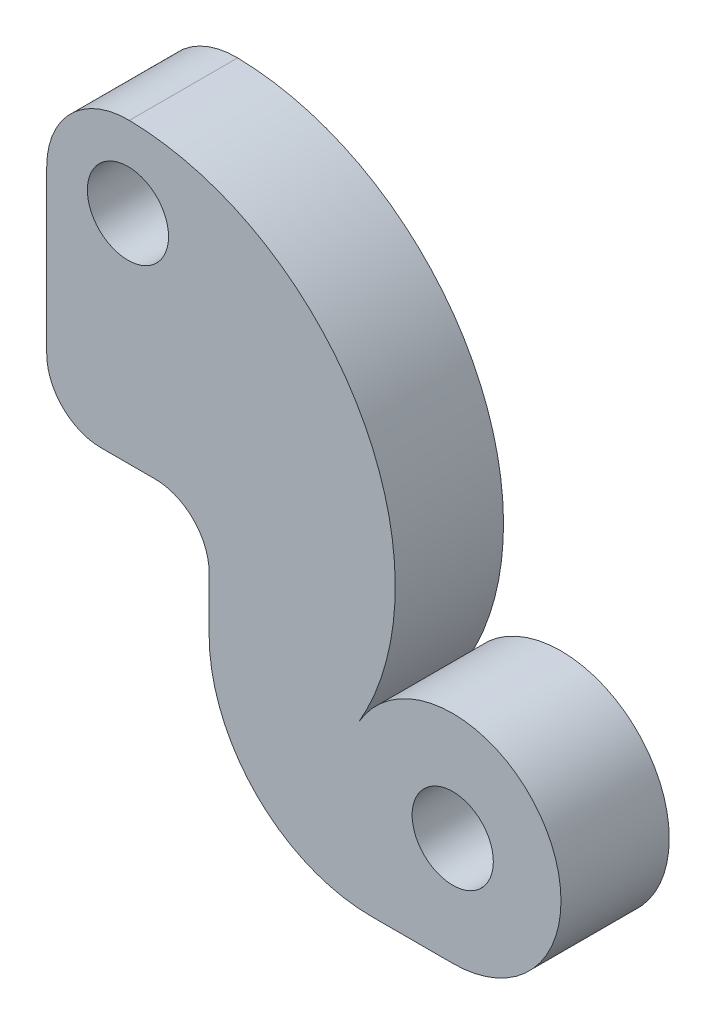
ISO-10303-21;
HEADER;
FILE_DESCRIPTION(('STEP AP214'),'2;1');
FILE_NAME('part.step','',(''),(''),'','','');
FILE_SCHEMA(('AUTOMOTIVE_DESIGN { 1 0 10303 214 1 1 1 1 }'));
ENDSEC;
DATA;
#1=APPLICATION_CONTEXT('core data for automotive mechanical design processes');
#2=APPLICATION_PROTOCOL_DEFINITION('international standard','automotive_design',2000,#1);
#3=PRODUCT_CONTEXT('',#1,'mechanical');
#4=PRODUCT('Part','Part','',(#3));
#5=PRODUCT_RELATED_PRODUCT_CATEGORY('part','',(#4));
#6=PRODUCT_DEFINITION_FORMATION('','',#4);
#7=PRODUCT_DEFINITION_CONTEXT('part definition',#1,'design');
#8=PRODUCT_DEFINITION('design','',#6,#7);
#9=PRODUCT_DEFINITION_SHAPE('','',#8);
#10=(LENGTH_UNIT() NAMED_UNIT(*) SI_UNIT(.MILLI.,.METRE.));
#11=(NAMED_UNIT(*) PLANE_ANGLE_UNIT() SI_UNIT($,.RADIAN.));
#12=(NAMED_UNIT(*) SI_UNIT($,.STERADIAN.) SOLID_ANGLE_UNIT());
#13=UNCERTAINTY_MEASURE_WITH_UNIT(LENGTH_MEASURE(1.E-05),#10,'distance_accuracy_value','');
#14=(GEOMETRIC_REPRESENTATION_CONTEXT(3) GLOBAL_UNCERTAINTY_ASSIGNED_CONTEXT((#13)) GLOBAL_UNIT_ASSIGNED_CONTEXT((#10,
#11,#12)) REPRESENTATION_CONTEXT('',''));
#15=CARTESIAN_POINT('',(0.,0.,0.));
#16=DIRECTION('',(0.,0.,1.));
#17=DIRECTION('',(1.,0.,0.));
#18=AXIS2_PLACEMENT_3D('',#15,#16,#17);
#19=CARTESIAN_POINT('',(-60.6186212966371,35.0054674600253,10.));
#20=DIRECTION('',(0.,0.,-1.));
#21=DIRECTION('',(-1.,0.,0.));
#22=AXIS2_PLACEMENT_3D('',#19,#20,#21);
#23=PLANE('',#22);
#24=CARTESIAN_POINT('',(-60.6186212966371,35.0054674600253,10.));
#25=DIRECTION('',(0.,0.,1.));
#26=DIRECTION('',(-1.,0.,0.));
#27=AXIS2_PLACEMENT_3D('',#24,#25,#26);
#28=CIRCLE('',#27,50.);
#29=CARTESIAN_POINT('',(-17.3196060847535,10.0015621314358,10.));
#30=VERTEX_POINT('',#29);
#31=CARTESIAN_POINT('',(-59.7348765871555,84.9976568028463,10.));
#32=VERTEX_POINT('',#31);
#33=EDGE_CURVE('E165',#30,#32,#28,.T.);
#34=ORIENTED_EDGE('',*,*,#33,.T.);
#35=CARTESIAN_POINT('',(-60.,70.,10.));
#36=DIRECTION('',(0.,0.,1.));
#37=DIRECTION('',(1.,0.,0.));
#38=AXIS2_PLACEMENT_3D('',#35,#36,#37);
#39=CIRCLE('',#38,15.);
#40=CARTESIAN_POINT('',(-75.,70.,10.));
#41=VERTEX_POINT('',#40);
#42=EDGE_CURVE('E103',#32,#41,#39,.T.);
#43=ORIENTED_EDGE('',*,*,#42,.T.);
#44=DIRECTION('',(0.,-1.,0.));
#45=VECTOR('',#44,1.);
#46=CARTESIAN_POINT('',(-75.,70.,10.));
#47=LINE('',#46,#45);
#48=CARTESIAN_POINT('',(-75.,40.0000000000001,10.));
#49=VERTEX_POINT('',#48);
#50=EDGE_CURVE('E186',#41,#49,#47,.T.);
#51=ORIENTED_EDGE('',*,*,#50,.T.);
#52=CARTESIAN_POINT('',(-65.,40.,10.));
#53=DIRECTION('',(0.,0.,1.));
#54=DIRECTION('',(1.,0.,0.));
#55=AXIS2_PLACEMENT_3D('',#52,#53,#54);
#56=CIRCLE('',#55,10.);
#57=CARTESIAN_POINT('',(-64.9999999999999,30.,10.));
#58=VERTEX_POINT('',#57);
#59=EDGE_CURVE('E205',#49,#58,#56,.T.);
#60=ORIENTED_EDGE('',*,*,#59,.T.);
#61=DIRECTION('',(1.,0.,0.));
#62=VECTOR('',#61,1.);
#63=CARTESIAN_POINT('',(-64.9999999999999,30.,10.));
#64=LINE('',#63,#62);
#65=CARTESIAN_POINT('',(-55.0000000000001,30.,10.));
#66=VERTEX_POINT('',#65);
#67=EDGE_CURVE('E202',#58,#66,#64,.T.);
#68=ORIENTED_EDGE('',*,*,#67,.T.);
#69=CARTESIAN_POINT('',(-55.,20.,10.));
#70=DIRECTION('',(0.,0.,-1.));
#71=DIRECTION('',(-1.,0.,0.));
#72=AXIS2_PLACEMENT_3D('',#69,#70,#71);
#73=CIRCLE('',#72,10.);
#74=CARTESIAN_POINT('',(-45.,19.9999999999999,10.));
#75=VERTEX_POINT('',#74);
#76=EDGE_CURVE('E204',#66,#75,#73,.T.);
#77=ORIENTED_EDGE('',*,*,#76,.T.);
#78=DIRECTION('',(0.,-1.,0.));
#79=VECTOR('',#78,1.);
#80=CARTESIAN_POINT('',(-45.,19.9999999999999,10.));
#81=LINE('',#80,#79);
#82=CARTESIAN_POINT('',(-45.,10.0000000000002,10.));
#83=VERTEX_POINT('',#82);
#84=EDGE_CURVE('E128',#75,#83,#81,.T.);
#85=ORIENTED_EDGE('',*,*,#84,.T.);
#86=CARTESIAN_POINT('',(-15.,10.,10.));
#87=DIRECTION('',(0.,0.,1.));
#88=DIRECTION('',(1.,0.,0.));
#89=AXIS2_PLACEMENT_3D('',#86,#87,#88);
#90=CIRCLE('',#89,30.);
#91=CARTESIAN_POINT('',(-14.9999999999998,-20.,10.));
#92=VERTEX_POINT('',#91);
#93=EDGE_CURVE('E122',#83,#92,#90,.T.);
#94=ORIENTED_EDGE('',*,*,#93,.T.);
#95=DIRECTION('',(1.,0.,0.));
#96=VECTOR('',#95,1.);
#97=CARTESIAN_POINT('',(-14.9999999999998,-20.,10.));
#98=LINE('',#97,#96);
#99=CARTESIAN_POINT('',(0.,-20.,10.));
#100=VERTEX_POINT('',#99);
#101=EDGE_CURVE('E126',#92,#100,#98,.T.);
#102=ORIENTED_EDGE('',*,*,#101,.T.);
#103=CARTESIAN_POINT('',(0.,0.,10.));
#104=DIRECTION('',(0.,0.,1.));
#105=DIRECTION('',(1.,0.,0.));
#106=AXIS2_PLACEMENT_3D('',#103,#104,#105);
#107=CIRCLE('',#106,20.);
#108=EDGE_CURVE('E54',#100,#30,#107,.T.);
#109=ORIENTED_EDGE('',*,*,#108,.T.);
#110=EDGE_LOOP('',(#34,#43,#51,#60,#68,#77,#85,#94,#102,#109));
#111=FACE_BOUND('',#110,.T.);
#112=CARTESIAN_POINT('',(0.,0.,10.));
#113=DIRECTION('',(0.,0.,1.));
#114=DIRECTION('',(1.,0.,0.));
#115=AXIS2_PLACEMENT_3D('',#112,#113,#114);
#116=CIRCLE('',#115,7.5);
#117=CARTESIAN_POINT('',(7.5,0.,10.));
#118=VERTEX_POINT('',#117);
#119=EDGE_CURVE('E150',#118,#118,#116,.T.);
#120=ORIENTED_EDGE('',*,*,#119,.F.);
#121=EDGE_LOOP('',(#120));
#122=FACE_BOUND('',#121,.T.);
#123=CARTESIAN_POINT('',(-60.,70.,10.));
#124=DIRECTION('',(0.,0.,1.));
#125=DIRECTION('',(1.,0.,0.));
#126=AXIS2_PLACEMENT_3D('',#123,#124,#125);
#127=CIRCLE('',#126,7.50000000000001);
#128=CARTESIAN_POINT('',(-52.5,70.,10.));
#129=VERTEX_POINT('',#128);
#130=EDGE_CURVE('E216',#129,#129,#127,.T.);
#131=ORIENTED_EDGE('',*,*,#130,.F.);
#132=EDGE_LOOP('',(#131));
#133=FACE_BOUND('',#132,.T.);
#134=ADVANCED_FACE('F37',(#111,#122,#133),#23,.F.);
#135=CARTESIAN_POINT('',(-60.6186212966371,35.0054674600253,-10.));
#136=DIRECTION('',(0.,0.,-1.));
#137=DIRECTION('',(-1.,0.,0.));
#138=AXIS2_PLACEMENT_3D('',#135,#136,#137);
#139=PLANE('',#138);
#140=CARTESIAN_POINT('',(0.,0.,-10.));
#141=DIRECTION('',(0.,0.,1.));
#142=DIRECTION('',(1.,0.,0.));
#143=AXIS2_PLACEMENT_3D('',#140,#141,#142);
#144=CIRCLE('',#143,7.5);
#145=CARTESIAN_POINT('',(7.5,0.,-10.));
#146=VERTEX_POINT('',#145);
#147=EDGE_CURVE('E213',#146,#146,#144,.T.);
#148=ORIENTED_EDGE('',*,*,#147,.T.);
#149=EDGE_LOOP('',(#148));
#150=FACE_BOUND('',#149,.T.);
#151=CARTESIAN_POINT('',(-60.6186212966371,35.0054674600253,-10.));
#152=DIRECTION('',(0.,0.,1.));
#153=DIRECTION('',(-1.,0.,0.));
#154=AXIS2_PLACEMENT_3D('',#151,#152,#153);
#155=CIRCLE('',#154,50.);
#156=CARTESIAN_POINT('',(-17.3196060847535,10.0015621314358,-10.));
#157=VERTEX_POINT('',#156);
#158=CARTESIAN_POINT('',(-59.7348765871555,84.9976568028463,-10.));
#159=VERTEX_POINT('',#158);
#160=EDGE_CURVE('E146',#157,#159,#155,.T.);
#161=ORIENTED_EDGE('',*,*,#160,.F.);
#162=CARTESIAN_POINT('',(0.,0.,-10.));
#163=DIRECTION('',(0.,0.,1.));
#164=DIRECTION('',(1.,0.,0.));
#165=AXIS2_PLACEMENT_3D('',#162,#163,#164);
#166=CIRCLE('',#165,20.);
#167=CARTESIAN_POINT('',(0.,-20.,-10.));
#168=VERTEX_POINT('',#167);
#169=EDGE_CURVE('E95',#168,#157,#166,.T.);
#170=ORIENTED_EDGE('',*,*,#169,.F.);
#171=DIRECTION('',(1.,0.,0.));
#172=VECTOR('',#171,1.);
#173=CARTESIAN_POINT('',(-14.9999999999998,-20.,-10.));
#174=LINE('',#173,#172);
#175=CARTESIAN_POINT('',(-14.9999999999998,-20.,-10.));
#176=VERTEX_POINT('',#175);
#177=EDGE_CURVE('E89',#176,#168,#174,.T.);
#178=ORIENTED_EDGE('',*,*,#177,.F.);
#179=CARTESIAN_POINT('',(-15.,10.,-10.));
#180=DIRECTION('',(0.,0.,1.));
#181=DIRECTION('',(1.,0.,0.));
#182=AXIS2_PLACEMENT_3D('',#179,#180,#181);
#183=CIRCLE('',#182,30.);
#184=CARTESIAN_POINT('',(-45.,10.0000000000002,-10.));
#185=VERTEX_POINT('',#184);
#186=EDGE_CURVE('E136',#185,#176,#183,.T.);
#187=ORIENTED_EDGE('',*,*,#186,.F.);
#188=DIRECTION('',(0.,-1.,0.));
#189=VECTOR('',#188,1.);
#190=CARTESIAN_POINT('',(-45.,19.9999999999999,-10.));
#191=LINE('',#190,#189);
#192=CARTESIAN_POINT('',(-45.,19.9999999999999,-10.));
#193=VERTEX_POINT('',#192);
#194=EDGE_CURVE('E160',#193,#185,#191,.T.);
#195=ORIENTED_EDGE('',*,*,#194,.F.);
#196=CARTESIAN_POINT('',(-55.,20.,-10.));
#197=DIRECTION('',(0.,0.,-1.));
#198=DIRECTION('',(-1.,0.,0.));
#199=AXIS2_PLACEMENT_3D('',#196,#197,#198);
#200=CIRCLE('',#199,10.);
#201=CARTESIAN_POINT('',(-55.0000000000001,30.,-10.));
#202=VERTEX_POINT('',#201);
#203=EDGE_CURVE('E158',#202,#193,#200,.T.);
#204=ORIENTED_EDGE('',*,*,#203,.F.);
#205=DIRECTION('',(1.,0.,0.));
#206=VECTOR('',#205,1.);
#207=CARTESIAN_POINT('',(-64.9999999999999,30.,-10.));
#208=LINE('',#207,#206);
#209=CARTESIAN_POINT('',(-64.9999999999999,30.,-10.));
#210=VERTEX_POINT('',#209);
#211=EDGE_CURVE('E156',#210,#202,#208,.T.);
#212=ORIENTED_EDGE('',*,*,#211,.F.);
#213=CARTESIAN_POINT('',(-65.,40.,-10.));
#214=DIRECTION('',(0.,0.,1.));
#215=DIRECTION('',(1.,0.,0.));
#216=AXIS2_PLACEMENT_3D('',#213,#214,#215);
#217=CIRCLE('',#216,10.);
#218=CARTESIAN_POINT('',(-75.,40.0000000000001,-10.));
#219=VERTEX_POINT('',#218);
#220=EDGE_CURVE('E154',#219,#210,#217,.T.);
#221=ORIENTED_EDGE('',*,*,#220,.F.);
#222=DIRECTION('',(0.,-1.,0.));
#223=VECTOR('',#222,1.);
#224=CARTESIAN_POINT('',(-75.,70.,-10.));
#225=LINE('',#224,#223);
#226=CARTESIAN_POINT('',(-75.,70.,-10.));
#227=VERTEX_POINT('',#226);
#228=EDGE_CURVE('E152',#227,#219,#225,.T.);
#229=ORIENTED_EDGE('',*,*,#228,.F.);
#230=CARTESIAN_POINT('',(-60.,70.,-10.));
#231=DIRECTION('',(0.,0.,1.));
#232=DIRECTION('',(1.,0.,0.));
#233=AXIS2_PLACEMENT_3D('',#230,#231,#232);
#234=CIRCLE('',#233,15.);
#235=EDGE_CURVE('E149',#159,#227,#234,.T.);
#236=ORIENTED_EDGE('',*,*,#235,.F.);
#237=EDGE_LOOP('',(#161,#170,#178,#187,#195,#204,#212,#221,#229,#236));
#238=FACE_BOUND('',#237,.T.);
#239=CARTESIAN_POINT('',(-60.,70.,-10.));
#240=DIRECTION('',(0.,0.,1.));
#241=DIRECTION('',(1.,0.,0.));
#242=AXIS2_PLACEMENT_3D('',#239,#240,#241);
#243=CIRCLE('',#242,7.50000000000001);
#244=CARTESIAN_POINT('',(-52.5,70.,-10.));
#245=VERTEX_POINT('',#244);
#246=EDGE_CURVE('E219',#245,#245,#243,.T.);
#247=ORIENTED_EDGE('',*,*,#246,.T.);
#248=EDGE_LOOP('',(#247));
#249=FACE_BOUND('',#248,.T.);
#250=ADVANCED_FACE('F190',(#150,#238,#249),#139,.T.);
#251=CARTESIAN_POINT('',(-60.6186212966371,35.0054674600253,10.));
#252=DIRECTION('',(0.,0.,-1.));
#253=DIRECTION('',(-1.,0.,0.));
#254=AXIS2_PLACEMENT_3D('',#251,#252,#253);
#255=CYLINDRICAL_SURFACE('',#254,50.);
#256=ORIENTED_EDGE('',*,*,#160,.T.);
#257=DIRECTION('',(0.,0.,-1.));
#258=VECTOR('',#257,1.);
#259=CARTESIAN_POINT('',(-59.7348765871555,84.9976568028463,10.));
#260=LINE('',#259,#258);
#261=EDGE_CURVE('E11',#32,#159,#260,.T.);
#262=ORIENTED_EDGE('',*,*,#261,.F.);
#263=ORIENTED_EDGE('',*,*,#33,.F.);
#264=DIRECTION('',(0.,0.,-1.));
#265=VECTOR('',#264,1.);
#266=CARTESIAN_POINT('',(-17.3196060847535,10.0015621314358,10.));
#267=LINE('',#266,#265);
#268=EDGE_CURVE('E142',#30,#157,#267,.T.);
#269=ORIENTED_EDGE('',*,*,#268,.T.);
#270=EDGE_LOOP('',(#256,#262,#263,#269));
#271=FACE_BOUND('',#270,.T.);
#272=ADVANCED_FACE('F39',(#271),#255,.T.);
#273=CARTESIAN_POINT('',(-60.,70.,10.));
#274=DIRECTION('',(0.,0.,-1.));
#275=DIRECTION('',(-1.,0.,0.));
#276=AXIS2_PLACEMENT_3D('',#273,#274,#275);
#277=CYLINDRICAL_SURFACE('',#276,15.);
#278=ORIENTED_EDGE('',*,*,#235,.T.);
#279=DIRECTION('',(0.,0.,-1.));
#280=VECTOR('',#279,1.);
#281=CARTESIAN_POINT('',(-75.,70.,10.));
#282=LINE('',#281,#280);
#283=EDGE_CURVE('E46',#41,#227,#282,.T.);
#284=ORIENTED_EDGE('',*,*,#283,.F.);
#285=ORIENTED_EDGE('',*,*,#42,.F.);
#286=ORIENTED_EDGE('',*,*,#261,.T.);
#287=EDGE_LOOP('',(#278,#284,#285,#286));
#288=FACE_BOUND('',#287,.T.);
#289=ADVANCED_FACE('F259',(#288),#277,.T.);
#290=CARTESIAN_POINT('',(-75.,70.,10.));
#291=DIRECTION('',(1.,0.,0.));
#292=DIRECTION('',(0.,0.,-1.));
#293=AXIS2_PLACEMENT_3D('',#290,#291,#292);
#294=PLANE('',#293);
#295=ORIENTED_EDGE('',*,*,#228,.T.);
#296=DIRECTION('',(0.,0.,-1.));
#297=VECTOR('',#296,1.);
#298=CARTESIAN_POINT('',(-75.,40.0000000000001,10.));
#299=LINE('',#298,#297);
#300=EDGE_CURVE('E178',#49,#219,#299,.T.);
#301=ORIENTED_EDGE('',*,*,#300,.F.);
#302=ORIENTED_EDGE('',*,*,#50,.F.);
#303=ORIENTED_EDGE('',*,*,#283,.T.);
#304=EDGE_LOOP('',(#295,#301,#302,#303));
#305=FACE_BOUND('',#304,.T.);
#306=ADVANCED_FACE('F184',(#305),#294,.F.);
#307=CARTESIAN_POINT('',(-65.,40.,10.));
#308=DIRECTION('',(0.,0.,-1.));
#309=DIRECTION('',(-1.,0.,0.));
#310=AXIS2_PLACEMENT_3D('',#307,#308,#309);
#311=CYLINDRICAL_SURFACE('',#310,10.);
#312=ORIENTED_EDGE('',*,*,#220,.T.);
#313=DIRECTION('',(0.,0.,-1.));
#314=VECTOR('',#313,1.);
#315=CARTESIAN_POINT('',(-64.9999999999999,30.,10.));
#316=LINE('',#315,#314);
#317=EDGE_CURVE('E175',#58,#210,#316,.T.);
#318=ORIENTED_EDGE('',*,*,#317,.F.);
#319=ORIENTED_EDGE('',*,*,#59,.F.);
#320=ORIENTED_EDGE('',*,*,#300,.T.);
#321=EDGE_LOOP('',(#312,#318,#319,#320));
#322=FACE_BOUND('',#321,.T.);
#323=ADVANCED_FACE('F196',(#322),#311,.T.);
#324=CARTESIAN_POINT('',(-64.9999999999999,30.,10.));
#325=DIRECTION('',(0.,1.,0.));
#326=DIRECTION('',(0.,0.,1.));
#327=AXIS2_PLACEMENT_3D('',#324,#325,#326);
#328=PLANE('',#327);
#329=ORIENTED_EDGE('',*,*,#211,.T.);
#330=DIRECTION('',(0.,0.,-1.));
#331=VECTOR('',#330,1.);
#332=CARTESIAN_POINT('',(-55.0000000000001,30.,10.));
#333=LINE('',#332,#331);
#334=EDGE_CURVE('E172',#66,#202,#333,.T.);
#335=ORIENTED_EDGE('',*,*,#334,.F.);
#336=ORIENTED_EDGE('',*,*,#67,.F.);
#337=ORIENTED_EDGE('',*,*,#317,.T.);
#338=EDGE_LOOP('',(#329,#335,#336,#337));
#339=FACE_BOUND('',#338,.T.);
#340=ADVANCED_FACE('F200',(#339),#328,.F.);
#341=CARTESIAN_POINT('',(-55.,20.,10.));
#342=DIRECTION('',(0.,0.,-1.));
#343=DIRECTION('',(-1.,0.,0.));
#344=AXIS2_PLACEMENT_3D('',#341,#342,#343);
#345=CYLINDRICAL_SURFACE('',#344,10.);
#346=ORIENTED_EDGE('',*,*,#203,.T.);
#347=DIRECTION('',(0.,0.,-1.));
#348=VECTOR('',#347,1.);
#349=CARTESIAN_POINT('',(-45.,19.9999999999999,10.));
#350=LINE('',#349,#348);
#351=EDGE_CURVE('E169',#75,#193,#350,.T.);
#352=ORIENTED_EDGE('',*,*,#351,.F.);
#353=ORIENTED_EDGE('',*,*,#76,.F.);
#354=ORIENTED_EDGE('',*,*,#334,.T.);
#355=EDGE_LOOP('',(#346,#352,#353,#354));
#356=FACE_BOUND('',#355,.T.);
#357=ADVANCED_FACE('F249',(#356),#345,.F.);
#358=CARTESIAN_POINT('',(-45.,19.9999999999999,10.));
#359=DIRECTION('',(1.,0.,0.));
#360=DIRECTION('',(0.,0.,-1.));
#361=AXIS2_PLACEMENT_3D('',#358,#359,#360);
#362=PLANE('',#361);
#363=ORIENTED_EDGE('',*,*,#194,.T.);
#364=DIRECTION('',(0.,0.,-1.));
#365=VECTOR('',#364,1.);
#366=CARTESIAN_POINT('',(-45.,10.0000000000002,10.));
#367=LINE('',#366,#365);
#368=EDGE_CURVE('E137',#83,#185,#367,.T.);
#369=ORIENTED_EDGE('',*,*,#368,.F.);
#370=ORIENTED_EDGE('',*,*,#84,.F.);
#371=ORIENTED_EDGE('',*,*,#351,.T.);
#372=EDGE_LOOP('',(#363,#369,#370,#371));
#373=FACE_BOUND('',#372,.T.);
#374=ADVANCED_FACE('F246',(#373),#362,.F.);
#375=CARTESIAN_POINT('',(-15.,10.,10.));
#376=DIRECTION('',(0.,0.,-1.));
#377=DIRECTION('',(-1.,0.,0.));
#378=AXIS2_PLACEMENT_3D('',#375,#376,#377);
#379=CYLINDRICAL_SURFACE('',#378,30.);
#380=ORIENTED_EDGE('',*,*,#186,.T.);
#381=DIRECTION('',(0.,0.,-1.));
#382=VECTOR('',#381,1.);
#383=CARTESIAN_POINT('',(-14.9999999999998,-20.,10.));
#384=LINE('',#383,#382);
#385=EDGE_CURVE('E133',#92,#176,#384,.T.);
#386=ORIENTED_EDGE('',*,*,#385,.F.);
#387=ORIENTED_EDGE('',*,*,#93,.F.);
#388=ORIENTED_EDGE('',*,*,#368,.T.);
#389=EDGE_LOOP('',(#380,#386,#387,#388));
#390=FACE_BOUND('',#389,.T.);
#391=ADVANCED_FACE('F134',(#390),#379,.T.);
#392=CARTESIAN_POINT('',(-14.9999999999998,-20.,10.));
#393=DIRECTION('',(0.,1.,0.));
#394=DIRECTION('',(0.,0.,1.));
#395=AXIS2_PLACEMENT_3D('',#392,#393,#394);
#396=PLANE('',#395);
#397=ORIENTED_EDGE('',*,*,#177,.T.);
#398=DIRECTION('',(0.,0.,-1.));
#399=VECTOR('',#398,1.);
#400=CARTESIAN_POINT('',(0.,-20.,10.));
#401=LINE('',#400,#399);
#402=EDGE_CURVE('E138',#100,#168,#401,.T.);
#403=ORIENTED_EDGE('',*,*,#402,.F.);
#404=ORIENTED_EDGE('',*,*,#101,.F.);
#405=ORIENTED_EDGE('',*,*,#385,.T.);
#406=EDGE_LOOP('',(#397,#403,#404,#405));
#407=FACE_BOUND('',#406,.T.);
#408=ADVANCED_FACE('F140',(#407),#396,.F.);
#409=CARTESIAN_POINT('',(0.,0.,10.));
#410=DIRECTION('',(0.,0.,-1.));
#411=DIRECTION('',(-1.,0.,0.));
#412=AXIS2_PLACEMENT_3D('',#409,#410,#411);
#413=CYLINDRICAL_SURFACE('',#412,20.);
#414=ORIENTED_EDGE('',*,*,#169,.T.);
#415=ORIENTED_EDGE('',*,*,#268,.F.);
#416=ORIENTED_EDGE('',*,*,#108,.F.);
#417=ORIENTED_EDGE('',*,*,#402,.T.);
#418=EDGE_LOOP('',(#414,#415,#416,#417));
#419=FACE_BOUND('',#418,.T.);
#420=ADVANCED_FACE('F239',(#419),#413,.T.);
#421=CARTESIAN_POINT('',(0.,0.,10.));
#422=DIRECTION('',(0.,0.,-1.));
#423=DIRECTION('',(-1.,0.,0.));
#424=AXIS2_PLACEMENT_3D('',#421,#422,#423);
#425=CYLINDRICAL_SURFACE('',#424,7.5);
#426=ORIENTED_EDGE('',*,*,#119,.T.);
#427=EDGE_LOOP('',(#426));
#428=FACE_BOUND('',#427,.T.);
#429=ORIENTED_EDGE('',*,*,#147,.F.);
#430=EDGE_LOOP('',(#429));
#431=FACE_BOUND('',#430,.T.);
#432=ADVANCED_FACE('F236',(#428,#431),#425,.F.);
#433=CARTESIAN_POINT('',(-60.,70.,10.));
#434=DIRECTION('',(0.,0.,-1.));
#435=DIRECTION('',(-1.,0.,0.));
#436=AXIS2_PLACEMENT_3D('',#433,#434,#435);
#437=CYLINDRICAL_SURFACE('',#436,7.50000000000001);
#438=ORIENTED_EDGE('',*,*,#130,.T.);
#439=EDGE_LOOP('',(#438));
#440=FACE_BOUND('',#439,.T.);
#441=ORIENTED_EDGE('',*,*,#246,.F.);
#442=EDGE_LOOP('',(#441));
#443=FACE_BOUND('',#442,.T.);
#444=ADVANCED_FACE('F225',(#440,#443),#437,.F.);
#445=CLOSED_SHELL('',(#134,#250,#272,#289,#306,#323,#340,#357,#374,#391,#408,#420,#432,#444));
#446=MANIFOLD_SOLID_BREP('B2',#445);
#447=ADVANCED_BREP_SHAPE_REPRESENTATION('',(#18,#446),#14);
#448=SHAPE_DEFINITION_REPRESENTATION(#9,#447);
ENDSEC;
END-ISO-10303-21;
